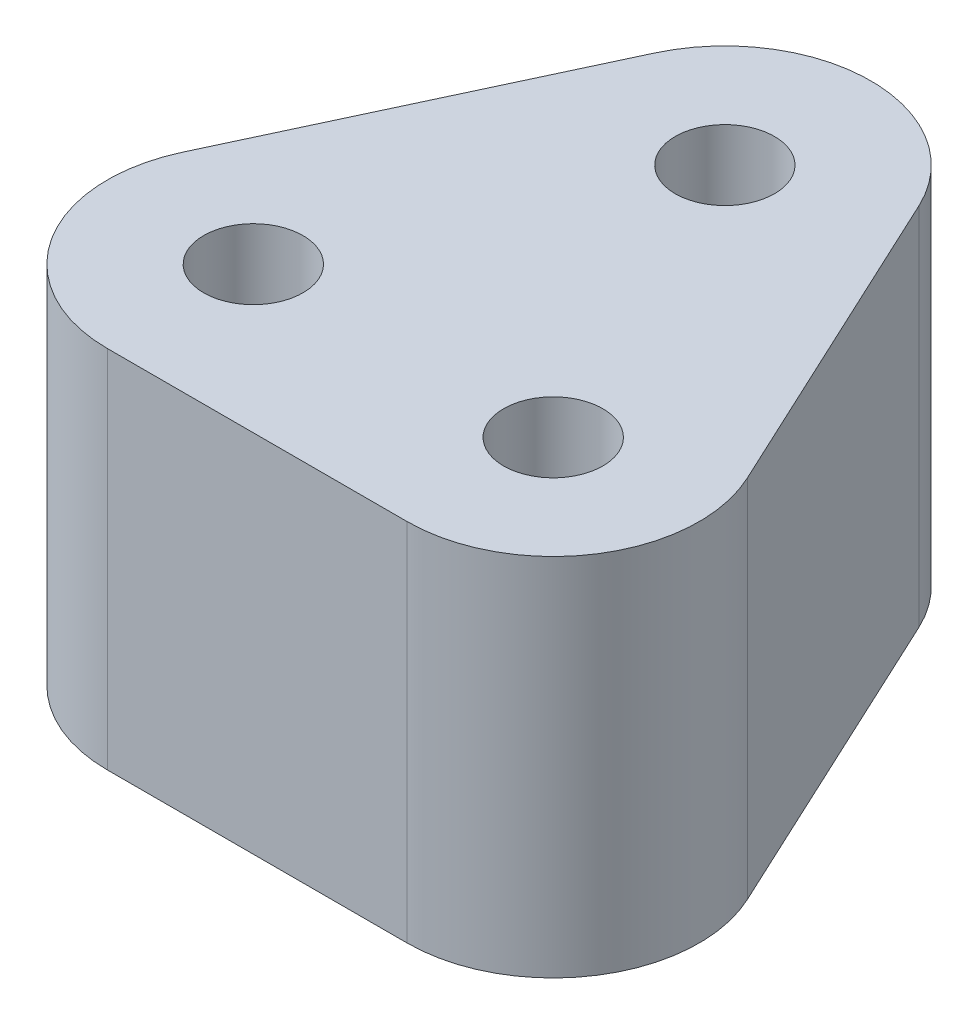
ISO-10303-21;
HEADER;
FILE_DESCRIPTION(('STEP AP214'),'2;1');
FILE_NAME('part.step','',(''),(''),'','','');
FILE_SCHEMA(('AUTOMOTIVE_DESIGN { 1 0 10303 214 1 1 1 1 }'));
ENDSEC;
DATA;
#1=APPLICATION_CONTEXT('core data for automotive mechanical design processes');
#2=APPLICATION_PROTOCOL_DEFINITION('international standard','automotive_design',2000,#1);
#3=PRODUCT_CONTEXT('',#1,'mechanical');
#4=PRODUCT('Part','Part','',(#3));
#5=PRODUCT_RELATED_PRODUCT_CATEGORY('part','',(#4));
#6=PRODUCT_DEFINITION_FORMATION('','',#4);
#7=PRODUCT_DEFINITION_CONTEXT('part definition',#1,'design');
#8=PRODUCT_DEFINITION('design','',#6,#7);
#9=PRODUCT_DEFINITION_SHAPE('','',#8);
#10=(LENGTH_UNIT() NAMED_UNIT(*) SI_UNIT(.MILLI.,.METRE.));
#11=(NAMED_UNIT(*) PLANE_ANGLE_UNIT() SI_UNIT($,.RADIAN.));
#12=(NAMED_UNIT(*) SI_UNIT($,.STERADIAN.) SOLID_ANGLE_UNIT());
#13=UNCERTAINTY_MEASURE_WITH_UNIT(LENGTH_MEASURE(1.E-05),#10,'distance_accuracy_value','');
#14=(GEOMETRIC_REPRESENTATION_CONTEXT(3) GLOBAL_UNCERTAINTY_ASSIGNED_CONTEXT((#13)) GLOBAL_UNIT_ASSIGNED_CONTEXT((#10,
#11,#12)) REPRESENTATION_CONTEXT('',''));
#15=CARTESIAN_POINT('',(0.,0.,0.));
#16=DIRECTION('',(0.,0.,1.));
#17=DIRECTION('',(1.,0.,0.));
#18=AXIS2_PLACEMENT_3D('',#15,#16,#17);
#19=CARTESIAN_POINT('',(0.,12.5,0.));
#20=DIRECTION('',(0.,1.,0.));
#21=DIRECTION('',(0.,0.,1.));
#22=AXIS2_PLACEMENT_3D('',#19,#20,#21);
#23=PLANE('',#22);
#24=CARTESIAN_POINT('',(-5.13547628440979,12.5,11.0130644320295));
#25=DIRECTION('',(0.,1.,0.));
#26=DIRECTION('',(0.,0.,1.));
#27=AXIS2_PLACEMENT_3D('',#24,#25,#26);
#28=CIRCLE('',#27,1.7);
#29=CARTESIAN_POINT('',(-5.13547628440979,12.5,12.7130644320295));
#30=VERTEX_POINT('',#29);
#31=EDGE_CURVE('E138',#30,#30,#28,.T.);
#32=ORIENTED_EDGE('',*,*,#31,.F.);
#33=EDGE_LOOP('',(#32));
#34=FACE_BOUND('',#33,.T.);
#35=CARTESIAN_POINT('',(5.1354762844098,12.5,11.0130644320295));
#36=DIRECTION('',(0.,1.,0.));
#37=DIRECTION('',(0.,0.,1.));
#38=AXIS2_PLACEMENT_3D('',#35,#36,#37);
#39=CIRCLE('',#38,1.7);
#40=CARTESIAN_POINT('',(5.1354762844098,12.5,12.7130644320295));
#41=VERTEX_POINT('',#40);
#42=EDGE_CURVE('E144',#41,#41,#39,.T.);
#43=ORIENTED_EDGE('',*,*,#42,.F.);
#44=EDGE_LOOP('',(#43));
#45=FACE_BOUND('',#44,.T.);
#46=DIRECTION('',(-0.4226182617407,0.,0.90630778703665));
#47=VECTOR('',#46,1.);
#48=CARTESIAN_POINT('',(-12.9839041699973,12.5,16.0130644320295));
#49=LINE('',#48,#47);
#50=CARTESIAN_POINT('',(-4.53153893518325,12.5,-2.1130913087035));
#51=VERTEX_POINT('',#50);
#52=CARTESIAN_POINT('',(-9.66701521959304,12.5,8.89997312332599));
#53=VERTEX_POINT('',#52);
#54=EDGE_CURVE('E111',#51,#53,#49,.T.);
#55=ORIENTED_EDGE('',*,*,#54,.T.);
#56=CARTESIAN_POINT('',(-5.13547628440979,12.5,11.0130644320295));
#57=DIRECTION('',(0.,1.,0.));
#58=DIRECTION('',(0.,0.,1.));
#59=AXIS2_PLACEMENT_3D('',#56,#57,#58);
#60=CIRCLE('',#59,5.);
#61=CARTESIAN_POINT('',(-5.13547628440979,12.5,16.0130644320295));
#62=VERTEX_POINT('',#61);
#63=EDGE_CURVE('E43',#53,#62,#60,.T.);
#64=ORIENTED_EDGE('',*,*,#63,.T.);
#65=DIRECTION('',(1.,0.,0.));
#66=VECTOR('',#65,1.);
#67=CARTESIAN_POINT('',(-12.9839041699973,12.5,16.0130644320295));
#68=LINE('',#67,#66);
#69=CARTESIAN_POINT('',(5.1354762844098,12.5,16.0130644320295));
#70=VERTEX_POINT('',#69);
#71=EDGE_CURVE('E97',#62,#70,#68,.T.);
#72=ORIENTED_EDGE('',*,*,#71,.T.);
#73=CARTESIAN_POINT('',(5.1354762844098,12.5,11.0130644320295));
#74=DIRECTION('',(0.,1.,0.));
#75=DIRECTION('',(0.,0.,1.));
#76=AXIS2_PLACEMENT_3D('',#73,#74,#75);
#77=CIRCLE('',#76,5.);
#78=CARTESIAN_POINT('',(9.66701521959305,12.5,8.89997312332598));
#79=VERTEX_POINT('',#78);
#80=EDGE_CURVE('E51',#70,#79,#77,.T.);
#81=ORIENTED_EDGE('',*,*,#80,.T.);
#82=DIRECTION('',(-0.422618261740701,0.,-0.906307787036649));
#83=VECTOR('',#82,1.);
#84=CARTESIAN_POINT('',(12.9839041699973,12.5,16.0130644320295));
#85=LINE('',#84,#83);
#86=CARTESIAN_POINT('',(4.53153893518325,12.5,-2.11309130870351));
#87=VERTEX_POINT('',#86);
#88=EDGE_CURVE('E89',#79,#87,#85,.T.);
#89=ORIENTED_EDGE('',*,*,#88,.T.);
#90=CARTESIAN_POINT('',(0.,12.5,0.));
#91=DIRECTION('',(0.,1.,0.));
#92=DIRECTION('',(0.,0.,1.));
#93=AXIS2_PLACEMENT_3D('',#90,#91,#92);
#94=CIRCLE('',#93,5.);
#95=EDGE_CURVE('E93',#87,#51,#94,.T.);
#96=ORIENTED_EDGE('',*,*,#95,.T.);
#97=EDGE_LOOP('',(#55,#64,#72,#81,#89,#96));
#98=FACE_BOUND('',#97,.T.);
#99=CARTESIAN_POINT('',(0.,12.5,0.));
#100=DIRECTION('',(0.,1.,0.));
#101=DIRECTION('',(0.,0.,1.));
#102=AXIS2_PLACEMENT_3D('',#99,#100,#101);
#103=CIRCLE('',#102,1.7);
#104=CARTESIAN_POINT('',(0.,12.5,1.7));
#105=VERTEX_POINT('',#104);
#106=EDGE_CURVE('E119',#105,#105,#103,.T.);
#107=ORIENTED_EDGE('',*,*,#106,.F.);
#108=EDGE_LOOP('',(#107));
#109=FACE_BOUND('',#108,.T.);
#110=ADVANCED_FACE('F34',(#34,#45,#98,#109),#23,.T.);
#111=CARTESIAN_POINT('',(0.,0.,0.));
#112=DIRECTION('',(0.,1.,0.));
#113=DIRECTION('',(0.,0.,1.));
#114=AXIS2_PLACEMENT_3D('',#111,#112,#113);
#115=PLANE('',#114);
#116=CARTESIAN_POINT('',(-5.13547628440979,0.,11.0130644320295));
#117=DIRECTION('',(0.,1.,0.));
#118=DIRECTION('',(0.,0.,1.));
#119=AXIS2_PLACEMENT_3D('',#116,#117,#118);
#120=CIRCLE('',#119,1.7);
#121=CARTESIAN_POINT('',(-5.13547628440979,0.,12.7130644320295));
#122=VERTEX_POINT('',#121);
#123=EDGE_CURVE('E38',#122,#122,#120,.T.);
#124=ORIENTED_EDGE('',*,*,#123,.T.);
#125=EDGE_LOOP('',(#124));
#126=FACE_BOUND('',#125,.T.);
#127=CARTESIAN_POINT('',(5.1354762844098,0.,11.0130644320295));
#128=DIRECTION('',(0.,1.,0.));
#129=DIRECTION('',(0.,0.,1.));
#130=AXIS2_PLACEMENT_3D('',#127,#128,#129);
#131=CIRCLE('',#130,1.7);
#132=CARTESIAN_POINT('',(5.1354762844098,0.,12.7130644320295));
#133=VERTEX_POINT('',#132);
#134=EDGE_CURVE('E136',#133,#133,#131,.T.);
#135=ORIENTED_EDGE('',*,*,#134,.T.);
#136=EDGE_LOOP('',(#135));
#137=FACE_BOUND('',#136,.T.);
#138=DIRECTION('',(1.,0.,0.));
#139=VECTOR('',#138,1.);
#140=CARTESIAN_POINT('',(-12.9839041699973,0.,16.0130644320295));
#141=LINE('',#140,#139);
#142=CARTESIAN_POINT('',(-5.13547628440979,0.,16.0130644320295));
#143=VERTEX_POINT('',#142);
#144=CARTESIAN_POINT('',(5.1354762844098,0.,16.0130644320295));
#145=VERTEX_POINT('',#144);
#146=EDGE_CURVE('E116',#143,#145,#141,.T.);
#147=ORIENTED_EDGE('',*,*,#146,.F.);
#148=CARTESIAN_POINT('',(-5.13547628440979,0.,11.0130644320295));
#149=DIRECTION('',(0.,1.,0.));
#150=DIRECTION('',(0.,0.,1.));
#151=AXIS2_PLACEMENT_3D('',#148,#149,#150);
#152=CIRCLE('',#151,5.);
#153=CARTESIAN_POINT('',(-9.66701521959304,0.,8.89997312332599));
#154=VERTEX_POINT('',#153);
#155=EDGE_CURVE('E132',#143,#154,#152,.F.);
#156=ORIENTED_EDGE('',*,*,#155,.T.);
#157=DIRECTION('',(-0.4226182617407,0.,0.90630778703665));
#158=VECTOR('',#157,1.);
#159=CARTESIAN_POINT('',(-12.9839041699973,0.,16.0130644320295));
#160=LINE('',#159,#158);
#161=CARTESIAN_POINT('',(-4.53153893518325,0.,-2.1130913087035));
#162=VERTEX_POINT('',#161);
#163=EDGE_CURVE('E123',#162,#154,#160,.T.);
#164=ORIENTED_EDGE('',*,*,#163,.F.);
#165=CARTESIAN_POINT('',(0.,0.,0.));
#166=DIRECTION('',(0.,1.,0.));
#167=DIRECTION('',(0.,0.,1.));
#168=AXIS2_PLACEMENT_3D('',#165,#166,#167);
#169=CIRCLE('',#168,5.);
#170=CARTESIAN_POINT('',(4.53153893518325,0.,-2.11309130870351));
#171=VERTEX_POINT('',#170);
#172=EDGE_CURVE('E121',#171,#162,#169,.T.);
#173=ORIENTED_EDGE('',*,*,#172,.F.);
#174=DIRECTION('',(-0.422618261740701,0.,-0.906307787036649));
#175=VECTOR('',#174,1.);
#176=CARTESIAN_POINT('',(12.9839041699973,0.,16.0130644320295));
#177=LINE('',#176,#175);
#178=CARTESIAN_POINT('',(9.66701521959305,0.,8.89997312332598));
#179=VERTEX_POINT('',#178);
#180=EDGE_CURVE('E103',#179,#171,#177,.T.);
#181=ORIENTED_EDGE('',*,*,#180,.F.);
#182=CARTESIAN_POINT('',(5.1354762844098,0.,11.0130644320295));
#183=DIRECTION('',(0.,1.,0.));
#184=DIRECTION('',(0.,0.,1.));
#185=AXIS2_PLACEMENT_3D('',#182,#183,#184);
#186=CIRCLE('',#185,5.);
#187=EDGE_CURVE('E130',#179,#145,#186,.F.);
#188=ORIENTED_EDGE('',*,*,#187,.T.);
#189=EDGE_LOOP('',(#147,#156,#164,#173,#181,#188));
#190=FACE_BOUND('',#189,.T.);
#191=CARTESIAN_POINT('',(0.,0.,0.));
#192=DIRECTION('',(0.,1.,0.));
#193=DIRECTION('',(0.,0.,1.));
#194=AXIS2_PLACEMENT_3D('',#191,#192,#193);
#195=CIRCLE('',#194,1.7);
#196=CARTESIAN_POINT('',(0.,0.,1.7));
#197=VERTEX_POINT('',#196);
#198=EDGE_CURVE('E142',#197,#197,#195,.T.);
#199=ORIENTED_EDGE('',*,*,#198,.T.);
#200=EDGE_LOOP('',(#199));
#201=FACE_BOUND('',#200,.T.);
#202=ADVANCED_FACE('F162',(#126,#137,#190,#201),#115,.F.);
#203=CARTESIAN_POINT('',(-12.9839041699973,12.5,16.0130644320295));
#204=DIRECTION('',(0.,0.,-1.));
#205=DIRECTION('',(-1.,0.,0.));
#206=AXIS2_PLACEMENT_3D('',#203,#204,#205);
#207=PLANE('',#206);
#208=ORIENTED_EDGE('',*,*,#71,.F.);
#209=DIRECTION('',(0.,-1.,0.));
#210=VECTOR('',#209,1.);
#211=CARTESIAN_POINT('',(-5.13547628440979,12.5,16.0130644320295));
#212=LINE('',#211,#210);
#213=EDGE_CURVE('E127',#62,#143,#212,.T.);
#214=ORIENTED_EDGE('',*,*,#213,.T.);
#215=ORIENTED_EDGE('',*,*,#146,.T.);
#216=DIRECTION('',(0.,-1.,0.));
#217=VECTOR('',#216,1.);
#218=CARTESIAN_POINT('',(5.1354762844098,12.5,16.0130644320295));
#219=LINE('',#218,#217);
#220=EDGE_CURVE('E106',#145,#70,#219,.F.);
#221=ORIENTED_EDGE('',*,*,#220,.T.);
#222=EDGE_LOOP('',(#208,#214,#215,#221));
#223=FACE_BOUND('',#222,.T.);
#224=ADVANCED_FACE('F168',(#223),#207,.F.);
#225=CARTESIAN_POINT('',(12.9839041699973,12.5,16.0130644320295));
#226=DIRECTION('',(-0.906307787036649,0.,0.422618261740701));
#227=DIRECTION('',(0.422618261740701,0.,0.906307787036649));
#228=AXIS2_PLACEMENT_3D('',#225,#226,#227);
#229=PLANE('',#228);
#230=ORIENTED_EDGE('',*,*,#88,.F.);
#231=DIRECTION('',(0.,-1.,0.));
#232=VECTOR('',#231,1.);
#233=CARTESIAN_POINT('',(9.66701521959305,12.5,8.89997312332598));
#234=LINE('',#233,#232);
#235=EDGE_CURVE('E11',#79,#179,#234,.T.);
#236=ORIENTED_EDGE('',*,*,#235,.T.);
#237=ORIENTED_EDGE('',*,*,#180,.T.);
#238=DIRECTION('',(0.,-1.,0.));
#239=VECTOR('',#238,1.);
#240=CARTESIAN_POINT('',(4.53153893518325,12.5,-2.11309130870351));
#241=LINE('',#240,#239);
#242=EDGE_CURVE('E100',#87,#171,#241,.T.);
#243=ORIENTED_EDGE('',*,*,#242,.F.);
#244=EDGE_LOOP('',(#230,#236,#237,#243));
#245=FACE_BOUND('',#244,.T.);
#246=ADVANCED_FACE('F101',(#245),#229,.F.);
#247=CARTESIAN_POINT('',(0.,12.5,0.));
#248=DIRECTION('',(0.,-1.,0.));
#249=DIRECTION('',(0.,0.,-1.));
#250=AXIS2_PLACEMENT_3D('',#247,#248,#249);
#251=CYLINDRICAL_SURFACE('',#250,5.);
#252=ORIENTED_EDGE('',*,*,#172,.T.);
#253=DIRECTION('',(0.,-1.,0.));
#254=VECTOR('',#253,1.);
#255=CARTESIAN_POINT('',(-4.53153893518325,12.5,-2.1130913087035));
#256=LINE('',#255,#254);
#257=EDGE_CURVE('E107',#51,#162,#256,.T.);
#258=ORIENTED_EDGE('',*,*,#257,.F.);
#259=ORIENTED_EDGE('',*,*,#95,.F.);
#260=ORIENTED_EDGE('',*,*,#242,.T.);
#261=EDGE_LOOP('',(#252,#258,#259,#260));
#262=FACE_BOUND('',#261,.T.);
#263=ADVANCED_FACE('F109',(#262),#251,.T.);
#264=CARTESIAN_POINT('',(-12.9839041699973,12.5,16.0130644320295));
#265=DIRECTION('',(0.90630778703665,0.,0.4226182617407));
#266=DIRECTION('',(0.4226182617407,0.,-0.90630778703665));
#267=AXIS2_PLACEMENT_3D('',#264,#265,#266);
#268=PLANE('',#267);
#269=ORIENTED_EDGE('',*,*,#163,.T.);
#270=DIRECTION('',(0.,-1.,0.));
#271=VECTOR('',#270,1.);
#272=CARTESIAN_POINT('',(-9.66701521959304,12.5,8.89997312332599));
#273=LINE('',#272,#271);
#274=EDGE_CURVE('E59',#154,#53,#273,.F.);
#275=ORIENTED_EDGE('',*,*,#274,.T.);
#276=ORIENTED_EDGE('',*,*,#54,.F.);
#277=ORIENTED_EDGE('',*,*,#257,.T.);
#278=EDGE_LOOP('',(#269,#275,#276,#277));
#279=FACE_BOUND('',#278,.T.);
#280=ADVANCED_FACE('F165',(#279),#268,.F.);
#281=CARTESIAN_POINT('',(0.,12.5,0.));
#282=DIRECTION('',(0.,-1.,0.));
#283=DIRECTION('',(0.,0.,-1.));
#284=AXIS2_PLACEMENT_3D('',#281,#282,#283);
#285=CYLINDRICAL_SURFACE('',#284,1.7);
#286=ORIENTED_EDGE('',*,*,#106,.T.);
#287=EDGE_LOOP('',(#286));
#288=FACE_BOUND('',#287,.T.);
#289=ORIENTED_EDGE('',*,*,#198,.F.);
#290=EDGE_LOOP('',(#289));
#291=FACE_BOUND('',#290,.T.);
#292=ADVANCED_FACE('F185',(#288,#291),#285,.F.);
#293=CARTESIAN_POINT('',(-5.13547628440979,12.5,11.0130644320295));
#294=DIRECTION('',(0.,-1.,0.));
#295=DIRECTION('',(0.,0.,-1.));
#296=AXIS2_PLACEMENT_3D('',#293,#294,#295);
#297=CYLINDRICAL_SURFACE('',#296,5.);
#298=ORIENTED_EDGE('',*,*,#63,.F.);
#299=ORIENTED_EDGE('',*,*,#274,.F.);
#300=ORIENTED_EDGE('',*,*,#155,.F.);
#301=ORIENTED_EDGE('',*,*,#213,.F.);
#302=EDGE_LOOP('',(#298,#299,#300,#301));
#303=FACE_BOUND('',#302,.T.);
#304=ADVANCED_FACE('F167',(#303),#297,.T.);
#305=CARTESIAN_POINT('',(5.1354762844098,12.5,11.0130644320295));
#306=DIRECTION('',(0.,-1.,0.));
#307=DIRECTION('',(0.,0.,-1.));
#308=AXIS2_PLACEMENT_3D('',#305,#306,#307);
#309=CYLINDRICAL_SURFACE('',#308,5.);
#310=ORIENTED_EDGE('',*,*,#80,.F.);
#311=ORIENTED_EDGE('',*,*,#220,.F.);
#312=ORIENTED_EDGE('',*,*,#187,.F.);
#313=ORIENTED_EDGE('',*,*,#235,.F.);
#314=EDGE_LOOP('',(#310,#311,#312,#313));
#315=FACE_BOUND('',#314,.T.);
#316=ADVANCED_FACE('F36',(#315),#309,.T.);
#317=CARTESIAN_POINT('',(5.1354762844098,-1.5,11.0130644320295));
#318=DIRECTION('',(0.,1.,0.));
#319=DIRECTION('',(0.,0.,1.));
#320=AXIS2_PLACEMENT_3D('',#317,#318,#319);
#321=CYLINDRICAL_SURFACE('',#320,1.7);
#322=ORIENTED_EDGE('',*,*,#42,.T.);
#323=EDGE_LOOP('',(#322));
#324=FACE_BOUND('',#323,.T.);
#325=ORIENTED_EDGE('',*,*,#134,.F.);
#326=EDGE_LOOP('',(#325));
#327=FACE_BOUND('',#326,.T.);
#328=ADVANCED_FACE('F216',(#324,#327),#321,.F.);
#329=CARTESIAN_POINT('',(-5.13547628440979,-1.5,11.0130644320295));
#330=DIRECTION('',(0.,1.,0.));
#331=DIRECTION('',(0.,0.,1.));
#332=AXIS2_PLACEMENT_3D('',#329,#330,#331);
#333=CYLINDRICAL_SURFACE('',#332,1.7);
#334=ORIENTED_EDGE('',*,*,#31,.T.);
#335=EDGE_LOOP('',(#334));
#336=FACE_BOUND('',#335,.T.);
#337=ORIENTED_EDGE('',*,*,#123,.F.);
#338=EDGE_LOOP('',(#337));
#339=FACE_BOUND('',#338,.T.);
#340=ADVANCED_FACE('F222',(#336,#339),#333,.F.);
#341=CLOSED_SHELL('',(#110,#202,#224,#246,#263,#280,#292,#304,#316,#328,#340));
#342=MANIFOLD_SOLID_BREP('B2',#341);
#343=ADVANCED_BREP_SHAPE_REPRESENTATION('',(#18,#342),#14);
#344=SHAPE_DEFINITION_REPRESENTATION(#9,#343);
ENDSEC;
END-ISO-10303-21;
